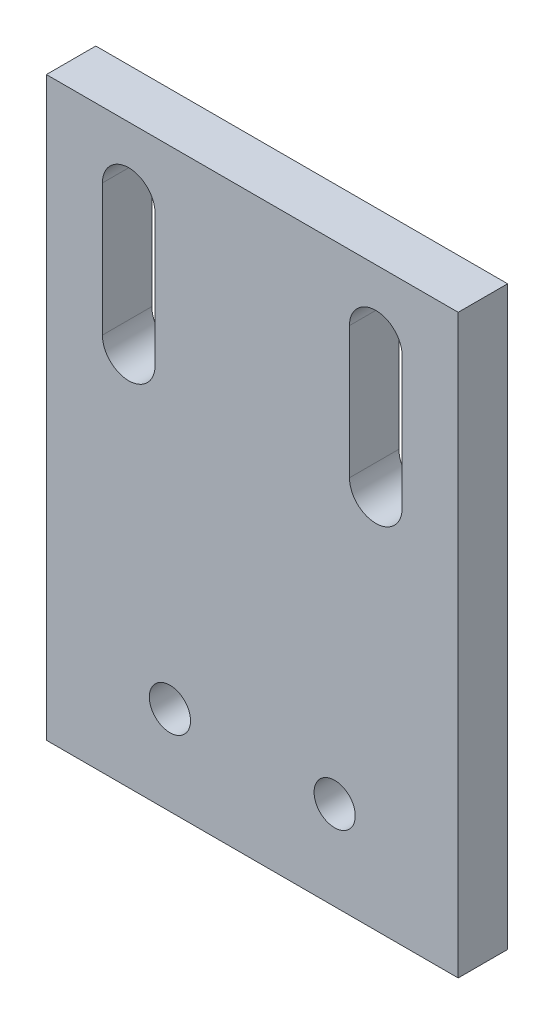
ISO-10303-21;
HEADER;
FILE_DESCRIPTION(('STEP AP214'),'2;1');
FILE_NAME('part.step','',(''),(''),'','','');
FILE_SCHEMA(('AUTOMOTIVE_DESIGN { 1 0 10303 214 1 1 1 1 }'));
ENDSEC;
DATA;
#1=APPLICATION_CONTEXT('core data for automotive mechanical design processes');
#2=APPLICATION_PROTOCOL_DEFINITION('international standard','automotive_design',2000,#1);
#3=PRODUCT_CONTEXT('',#1,'mechanical');
#4=PRODUCT('Part','Part','',(#3));
#5=PRODUCT_RELATED_PRODUCT_CATEGORY('part','',(#4));
#6=PRODUCT_DEFINITION_FORMATION('','',#4);
#7=PRODUCT_DEFINITION_CONTEXT('part definition',#1,'design');
#8=PRODUCT_DEFINITION('design','',#6,#7);
#9=PRODUCT_DEFINITION_SHAPE('','',#8);
#10=(LENGTH_UNIT() NAMED_UNIT(*) SI_UNIT(.MILLI.,.METRE.));
#11=(NAMED_UNIT(*) PLANE_ANGLE_UNIT() SI_UNIT($,.RADIAN.));
#12=(NAMED_UNIT(*) SI_UNIT($,.STERADIAN.) SOLID_ANGLE_UNIT());
#13=UNCERTAINTY_MEASURE_WITH_UNIT(LENGTH_MEASURE(1.E-05),#10,'distance_accuracy_value','');
#14=(GEOMETRIC_REPRESENTATION_CONTEXT(3) GLOBAL_UNCERTAINTY_ASSIGNED_CONTEXT((#13)) GLOBAL_UNIT_ASSIGNED_CONTEXT((#10,
#11,#12)) REPRESENTATION_CONTEXT('',''));
#15=CARTESIAN_POINT('',(0.,0.,0.));
#16=DIRECTION('',(0.,0.,1.));
#17=DIRECTION('',(1.,0.,0.));
#18=AXIS2_PLACEMENT_3D('',#15,#16,#17);
#19=CARTESIAN_POINT('',(110.031636064282,-1.89706178448641,3.));
#20=DIRECTION('',(1.,0.,0.));
#21=DIRECTION('',(0.,0.,-1.));
#22=AXIS2_PLACEMENT_3D('',#19,#20,#21);
#23=PLANE('',#22);
#24=DIRECTION('',(0.,-1.,0.));
#25=VECTOR('',#24,1.);
#26=CARTESIAN_POINT('',(110.031636064282,-1.89706178448641,0.));
#27=LINE('',#26,#25);
#28=CARTESIAN_POINT('',(110.031636064282,33.1029382155136,0.));
#29=VERTEX_POINT('',#28);
#30=CARTESIAN_POINT('',(110.031636064282,-1.89706178448641,0.));
#31=VERTEX_POINT('',#30);
#32=EDGE_CURVE('E202',#29,#31,#27,.T.);
#33=ORIENTED_EDGE('',*,*,#32,.T.);
#34=DIRECTION('',(0.,0.,-1.));
#35=VECTOR('',#34,1.);
#36=CARTESIAN_POINT('',(110.031636064282,-1.89706178448641,3.));
#37=LINE('',#36,#35);
#38=CARTESIAN_POINT('',(110.031636064282,-1.89706178448641,3.));
#39=VERTEX_POINT('',#38);
#40=EDGE_CURVE('E11',#39,#31,#37,.T.);
#41=ORIENTED_EDGE('',*,*,#40,.F.);
#42=DIRECTION('',(0.,-1.,0.));
#43=VECTOR('',#42,1.);
#44=CARTESIAN_POINT('',(110.031636064282,-1.89706178448641,3.));
#45=LINE('',#44,#43);
#46=CARTESIAN_POINT('',(110.031636064282,33.1029382155136,3.));
#47=VERTEX_POINT('',#46);
#48=EDGE_CURVE('E203',#47,#39,#45,.T.);
#49=ORIENTED_EDGE('',*,*,#48,.F.);
#50=DIRECTION('',(0.,0.,-1.));
#51=VECTOR('',#50,1.);
#52=CARTESIAN_POINT('',(110.031636064282,33.1029382155136,3.));
#53=LINE('',#52,#51);
#54=EDGE_CURVE('E213',#47,#29,#53,.T.);
#55=ORIENTED_EDGE('',*,*,#54,.T.);
#56=EDGE_LOOP('',(#33,#41,#49,#55));
#57=FACE_BOUND('',#56,.T.);
#58=ADVANCED_FACE('F34',(#57),#23,.F.);
#59=CARTESIAN_POINT('',(110.031636064282,-1.89706178448641,3.));
#60=DIRECTION('',(0.,1.,0.));
#61=DIRECTION('',(0.,0.,1.));
#62=AXIS2_PLACEMENT_3D('',#59,#60,#61);
#63=PLANE('',#62);
#64=DIRECTION('',(1.,0.,0.));
#65=VECTOR('',#64,1.);
#66=CARTESIAN_POINT('',(110.031636064282,-1.89706178448641,0.));
#67=LINE('',#66,#65);
#68=CARTESIAN_POINT('',(135.031636064282,-1.89706178448641,0.));
#69=VERTEX_POINT('',#68);
#70=EDGE_CURVE('E216',#31,#69,#67,.T.);
#71=ORIENTED_EDGE('',*,*,#70,.T.);
#72=DIRECTION('',(0.,0.,-1.));
#73=VECTOR('',#72,1.);
#74=CARTESIAN_POINT('',(135.031636064282,-1.89706178448641,3.));
#75=LINE('',#74,#73);
#76=CARTESIAN_POINT('',(135.031636064282,-1.89706178448641,3.));
#77=VERTEX_POINT('',#76);
#78=EDGE_CURVE('E41',#77,#69,#75,.T.);
#79=ORIENTED_EDGE('',*,*,#78,.F.);
#80=DIRECTION('',(1.,0.,0.));
#81=VECTOR('',#80,1.);
#82=CARTESIAN_POINT('',(110.031636064282,-1.89706178448641,3.));
#83=LINE('',#82,#81);
#84=EDGE_CURVE('E206',#39,#77,#83,.T.);
#85=ORIENTED_EDGE('',*,*,#84,.F.);
#86=ORIENTED_EDGE('',*,*,#40,.T.);
#87=EDGE_LOOP('',(#71,#79,#85,#86));
#88=FACE_BOUND('',#87,.T.);
#89=ADVANCED_FACE('F245',(#88),#63,.F.);
#90=CARTESIAN_POINT('',(135.031636064282,-1.89706178448641,3.));
#91=DIRECTION('',(-1.,0.,0.));
#92=DIRECTION('',(0.,0.,1.));
#93=AXIS2_PLACEMENT_3D('',#90,#91,#92);
#94=PLANE('',#93);
#95=DIRECTION('',(0.,1.,0.));
#96=VECTOR('',#95,1.);
#97=CARTESIAN_POINT('',(135.031636064282,-1.89706178448641,0.));
#98=LINE('',#97,#96);
#99=CARTESIAN_POINT('',(135.031636064282,33.1029382155136,0.));
#100=VERTEX_POINT('',#99);
#101=EDGE_CURVE('E218',#69,#100,#98,.T.);
#102=ORIENTED_EDGE('',*,*,#101,.T.);
#103=DIRECTION('',(0.,0.,-1.));
#104=VECTOR('',#103,1.);
#105=CARTESIAN_POINT('',(135.031636064282,33.1029382155136,3.));
#106=LINE('',#105,#104);
#107=CARTESIAN_POINT('',(135.031636064282,33.1029382155136,3.));
#108=VERTEX_POINT('',#107);
#109=EDGE_CURVE('E223',#108,#100,#106,.T.);
#110=ORIENTED_EDGE('',*,*,#109,.F.);
#111=DIRECTION('',(0.,1.,0.));
#112=VECTOR('',#111,1.);
#113=CARTESIAN_POINT('',(135.031636064282,-1.89706178448641,3.));
#114=LINE('',#113,#112);
#115=EDGE_CURVE('E209',#77,#108,#114,.T.);
#116=ORIENTED_EDGE('',*,*,#115,.F.);
#117=ORIENTED_EDGE('',*,*,#78,.T.);
#118=EDGE_LOOP('',(#102,#110,#116,#117));
#119=FACE_BOUND('',#118,.T.);
#120=ADVANCED_FACE('F230',(#119),#94,.F.);
#121=CARTESIAN_POINT('',(110.031636064282,33.1029382155136,3.));
#122=DIRECTION('',(0.,-1.,0.));
#123=DIRECTION('',(0.,0.,-1.));
#124=AXIS2_PLACEMENT_3D('',#121,#122,#123);
#125=PLANE('',#124);
#126=DIRECTION('',(-1.,0.,0.));
#127=VECTOR('',#126,1.);
#128=CARTESIAN_POINT('',(110.031636064282,33.1029382155136,0.));
#129=LINE('',#128,#127);
#130=EDGE_CURVE('E207',#100,#29,#129,.T.);
#131=ORIENTED_EDGE('',*,*,#130,.T.);
#132=ORIENTED_EDGE('',*,*,#54,.F.);
#133=DIRECTION('',(-1.,0.,0.));
#134=VECTOR('',#133,1.);
#135=CARTESIAN_POINT('',(110.031636064282,33.1029382155136,3.));
#136=LINE('',#135,#134);
#137=EDGE_CURVE('E211',#108,#47,#136,.T.);
#138=ORIENTED_EDGE('',*,*,#137,.F.);
#139=ORIENTED_EDGE('',*,*,#109,.T.);
#140=EDGE_LOOP('',(#131,#132,#138,#139));
#141=FACE_BOUND('',#140,.T.);
#142=ADVANCED_FACE('F238',(#141),#125,.F.);
#143=CARTESIAN_POINT('',(0.,0.,3.));
#144=DIRECTION('',(0.,0.,-1.));
#145=DIRECTION('',(-1.,0.,0.));
#146=AXIS2_PLACEMENT_3D('',#143,#144,#145);
#147=PLANE('',#146);
#148=DIRECTION('',(0.,-1.,0.));
#149=VECTOR('',#148,1.);
#150=CARTESIAN_POINT('',(128.431636064282,29.1029382155136,3.));
#151=LINE('',#150,#149);
#152=CARTESIAN_POINT('',(128.431636064282,29.1029382155136,3.));
#153=VERTEX_POINT('',#152);
#154=CARTESIAN_POINT('',(128.431636064282,21.1029382155136,3.));
#155=VERTEX_POINT('',#154);
#156=EDGE_CURVE('E149',#153,#155,#151,.T.);
#157=ORIENTED_EDGE('',*,*,#156,.F.);
#158=CARTESIAN_POINT('',(130.031636064282,29.1029382155136,3.));
#159=DIRECTION('',(0.,0.,1.));
#160=DIRECTION('',(1.,0.,0.));
#161=AXIS2_PLACEMENT_3D('',#158,#159,#160);
#162=CIRCLE('',#161,1.59999999999999);
#163=CARTESIAN_POINT('',(131.631636064282,29.1029382155136,3.));
#164=VERTEX_POINT('',#163);
#165=EDGE_CURVE('E48',#164,#153,#162,.T.);
#166=ORIENTED_EDGE('',*,*,#165,.F.);
#167=DIRECTION('',(0.,1.,0.));
#168=VECTOR('',#167,1.);
#169=CARTESIAN_POINT('',(131.631636064282,29.1029382155136,3.));
#170=LINE('',#169,#168);
#171=CARTESIAN_POINT('',(131.631636064282,21.1029382155136,3.));
#172=VERTEX_POINT('',#171);
#173=EDGE_CURVE('E140',#172,#164,#170,.T.);
#174=ORIENTED_EDGE('',*,*,#173,.F.);
#175=CARTESIAN_POINT('',(130.031636064282,21.1029382155136,3.));
#176=DIRECTION('',(0.,0.,1.));
#177=DIRECTION('',(1.,0.,0.));
#178=AXIS2_PLACEMENT_3D('',#175,#176,#177);
#179=CIRCLE('',#178,1.59999999999999);
#180=EDGE_CURVE('E143',#155,#172,#179,.T.);
#181=ORIENTED_EDGE('',*,*,#180,.F.);
#182=EDGE_LOOP('',(#157,#166,#174,#181));
#183=FACE_BOUND('',#182,.T.);
#184=DIRECTION('',(0.,-1.,0.));
#185=VECTOR('',#184,1.);
#186=CARTESIAN_POINT('',(113.431636064282,29.1029382155136,3.));
#187=LINE('',#186,#185);
#188=CARTESIAN_POINT('',(113.431636064282,29.1029382155136,3.));
#189=VERTEX_POINT('',#188);
#190=CARTESIAN_POINT('',(113.431636064282,21.1029382155136,3.));
#191=VERTEX_POINT('',#190);
#192=EDGE_CURVE('E174',#189,#191,#187,.T.);
#193=ORIENTED_EDGE('',*,*,#192,.F.);
#194=CARTESIAN_POINT('',(115.031636064282,29.1029382155136,3.));
#195=DIRECTION('',(0.,0.,1.));
#196=DIRECTION('',(1.,0.,0.));
#197=AXIS2_PLACEMENT_3D('',#194,#195,#196);
#198=CIRCLE('',#197,1.60000000000002);
#199=CARTESIAN_POINT('',(116.631636064282,29.1029382155136,3.));
#200=VERTEX_POINT('',#199);
#201=EDGE_CURVE('E155',#200,#189,#198,.T.);
#202=ORIENTED_EDGE('',*,*,#201,.F.);
#203=DIRECTION('',(0.,1.,0.));
#204=VECTOR('',#203,1.);
#205=CARTESIAN_POINT('',(116.631636064282,29.1029382155136,3.));
#206=LINE('',#205,#204);
#207=CARTESIAN_POINT('',(116.631636064282,21.1029382155136,3.));
#208=VERTEX_POINT('',#207);
#209=EDGE_CURVE('E163',#208,#200,#206,.T.);
#210=ORIENTED_EDGE('',*,*,#209,.F.);
#211=CARTESIAN_POINT('',(115.031636064282,21.1029382155136,3.));
#212=DIRECTION('',(0.,0.,1.));
#213=DIRECTION('',(1.,0.,0.));
#214=AXIS2_PLACEMENT_3D('',#211,#212,#213);
#215=CIRCLE('',#214,1.6);
#216=EDGE_CURVE('E177',#191,#208,#215,.T.);
#217=ORIENTED_EDGE('',*,*,#216,.F.);
#218=EDGE_LOOP('',(#193,#202,#210,#217));
#219=FACE_BOUND('',#218,.T.);
#220=CARTESIAN_POINT('',(117.531636064282,3.50000000000017,3.));
#221=DIRECTION('',(0.,0.,1.));
#222=DIRECTION('',(1.,0.,0.));
#223=AXIS2_PLACEMENT_3D('',#220,#221,#222);
#224=CIRCLE('',#223,1.24999999999999);
#225=CARTESIAN_POINT('',(118.781636064282,3.50000000000017,3.));
#226=VERTEX_POINT('',#225);
#227=EDGE_CURVE('E184',#226,#226,#224,.T.);
#228=ORIENTED_EDGE('',*,*,#227,.F.);
#229=EDGE_LOOP('',(#228));
#230=FACE_BOUND('',#229,.T.);
#231=CARTESIAN_POINT('',(127.531636064282,3.50000000000017,3.));
#232=DIRECTION('',(0.,0.,1.));
#233=DIRECTION('',(1.,0.,0.));
#234=AXIS2_PLACEMENT_3D('',#231,#232,#233);
#235=CIRCLE('',#234,1.25);
#236=CARTESIAN_POINT('',(128.781636064282,3.50000000000017,3.));
#237=VERTEX_POINT('',#236);
#238=EDGE_CURVE('E196',#237,#237,#235,.T.);
#239=ORIENTED_EDGE('',*,*,#238,.F.);
#240=EDGE_LOOP('',(#239));
#241=FACE_BOUND('',#240,.T.);
#242=ORIENTED_EDGE('',*,*,#48,.T.);
#243=ORIENTED_EDGE('',*,*,#84,.T.);
#244=ORIENTED_EDGE('',*,*,#115,.T.);
#245=ORIENTED_EDGE('',*,*,#137,.T.);
#246=EDGE_LOOP('',(#242,#243,#244,#245));
#247=FACE_BOUND('',#246,.T.);
#248=ADVANCED_FACE('F244',(#183,#219,#230,#241,#247),#147,.F.);
#249=CARTESIAN_POINT('',(0.,0.,0.));
#250=DIRECTION('',(0.,0.,-1.));
#251=DIRECTION('',(-1.,0.,0.));
#252=AXIS2_PLACEMENT_3D('',#249,#250,#251);
#253=PLANE('',#252);
#254=CARTESIAN_POINT('',(130.031636064282,29.1029382155136,0.));
#255=DIRECTION('',(0.,0.,1.));
#256=DIRECTION('',(1.,0.,0.));
#257=AXIS2_PLACEMENT_3D('',#254,#255,#256);
#258=CIRCLE('',#257,1.59999999999999);
#259=CARTESIAN_POINT('',(131.631636064282,29.1029382155136,0.));
#260=VERTEX_POINT('',#259);
#261=CARTESIAN_POINT('',(128.431636064282,29.1029382155136,0.));
#262=VERTEX_POINT('',#261);
#263=EDGE_CURVE('E124',#260,#262,#258,.T.);
#264=ORIENTED_EDGE('',*,*,#263,.T.);
#265=DIRECTION('',(0.,-1.,0.));
#266=VECTOR('',#265,1.);
#267=CARTESIAN_POINT('',(128.431636064282,29.1029382155136,0.));
#268=LINE('',#267,#266);
#269=CARTESIAN_POINT('',(128.431636064282,21.1029382155136,0.));
#270=VERTEX_POINT('',#269);
#271=EDGE_CURVE('E133',#262,#270,#268,.T.);
#272=ORIENTED_EDGE('',*,*,#271,.T.);
#273=CARTESIAN_POINT('',(130.031636064282,21.1029382155136,0.));
#274=DIRECTION('',(0.,0.,1.));
#275=DIRECTION('',(1.,0.,0.));
#276=AXIS2_PLACEMENT_3D('',#273,#274,#275);
#277=CIRCLE('',#276,1.59999999999999);
#278=CARTESIAN_POINT('',(131.631636064282,21.1029382155136,0.));
#279=VERTEX_POINT('',#278);
#280=EDGE_CURVE('E56',#270,#279,#277,.T.);
#281=ORIENTED_EDGE('',*,*,#280,.T.);
#282=DIRECTION('',(0.,1.,0.));
#283=VECTOR('',#282,1.);
#284=CARTESIAN_POINT('',(131.631636064282,29.1029382155136,0.));
#285=LINE('',#284,#283);
#286=EDGE_CURVE('E130',#279,#260,#285,.T.);
#287=ORIENTED_EDGE('',*,*,#286,.T.);
#288=EDGE_LOOP('',(#264,#272,#281,#287));
#289=FACE_BOUND('',#288,.T.);
#290=CARTESIAN_POINT('',(115.031636064282,29.1029382155136,0.));
#291=DIRECTION('',(0.,0.,1.));
#292=DIRECTION('',(1.,0.,0.));
#293=AXIS2_PLACEMENT_3D('',#290,#291,#292);
#294=CIRCLE('',#293,1.60000000000002);
#295=CARTESIAN_POINT('',(116.631636064282,29.1029382155136,0.));
#296=VERTEX_POINT('',#295);
#297=CARTESIAN_POINT('',(113.431636064282,29.1029382155136,0.));
#298=VERTEX_POINT('',#297);
#299=EDGE_CURVE('E159',#296,#298,#294,.T.);
#300=ORIENTED_EDGE('',*,*,#299,.T.);
#301=DIRECTION('',(0.,-1.,0.));
#302=VECTOR('',#301,1.);
#303=CARTESIAN_POINT('',(113.431636064282,29.1029382155136,0.));
#304=LINE('',#303,#302);
#305=CARTESIAN_POINT('',(113.431636064282,21.1029382155136,0.));
#306=VERTEX_POINT('',#305);
#307=EDGE_CURVE('E162',#298,#306,#304,.T.);
#308=ORIENTED_EDGE('',*,*,#307,.T.);
#309=CARTESIAN_POINT('',(115.031636064282,21.1029382155136,0.));
#310=DIRECTION('',(0.,0.,1.));
#311=DIRECTION('',(1.,0.,0.));
#312=AXIS2_PLACEMENT_3D('',#309,#310,#311);
#313=CIRCLE('',#312,1.6);
#314=CARTESIAN_POINT('',(116.631636064282,21.1029382155136,0.));
#315=VERTEX_POINT('',#314);
#316=EDGE_CURVE('E166',#306,#315,#313,.T.);
#317=ORIENTED_EDGE('',*,*,#316,.T.);
#318=DIRECTION('',(0.,1.,0.));
#319=VECTOR('',#318,1.);
#320=CARTESIAN_POINT('',(116.631636064282,29.1029382155136,0.));
#321=LINE('',#320,#319);
#322=EDGE_CURVE('E169',#315,#296,#321,.T.);
#323=ORIENTED_EDGE('',*,*,#322,.T.);
#324=EDGE_LOOP('',(#300,#308,#317,#323));
#325=FACE_BOUND('',#324,.T.);
#326=CARTESIAN_POINT('',(117.531636064282,3.50000000000017,0.));
#327=DIRECTION('',(0.,0.,1.));
#328=DIRECTION('',(1.,0.,0.));
#329=AXIS2_PLACEMENT_3D('',#326,#327,#328);
#330=CIRCLE('',#329,1.25);
#331=CARTESIAN_POINT('',(118.781636064282,3.50000000000017,0.));
#332=VERTEX_POINT('',#331);
#333=EDGE_CURVE('E193',#332,#332,#330,.T.);
#334=ORIENTED_EDGE('',*,*,#333,.T.);
#335=EDGE_LOOP('',(#334));
#336=FACE_BOUND('',#335,.T.);
#337=CARTESIAN_POINT('',(127.531636064282,3.50000000000017,0.));
#338=DIRECTION('',(0.,0.,1.));
#339=DIRECTION('',(1.,0.,0.));
#340=AXIS2_PLACEMENT_3D('',#337,#338,#339);
#341=CIRCLE('',#340,1.25);
#342=CARTESIAN_POINT('',(128.781636064282,3.50000000000017,0.));
#343=VERTEX_POINT('',#342);
#344=EDGE_CURVE('E199',#343,#343,#341,.T.);
#345=ORIENTED_EDGE('',*,*,#344,.T.);
#346=EDGE_LOOP('',(#345));
#347=FACE_BOUND('',#346,.T.);
#348=ORIENTED_EDGE('',*,*,#32,.F.);
#349=ORIENTED_EDGE('',*,*,#130,.F.);
#350=ORIENTED_EDGE('',*,*,#101,.F.);
#351=ORIENTED_EDGE('',*,*,#70,.F.);
#352=EDGE_LOOP('',(#348,#349,#350,#351));
#353=FACE_BOUND('',#352,.T.);
#354=ADVANCED_FACE('F137',(#289,#325,#336,#347,#353),#253,.T.);
#355=CARTESIAN_POINT('',(127.531636064282,3.50000000000017,3.));
#356=DIRECTION('',(0.,0.,1.));
#357=DIRECTION('',(1.,0.,0.));
#358=AXIS2_PLACEMENT_3D('',#355,#356,#357);
#359=CYLINDRICAL_SURFACE('',#358,1.25);
#360=ORIENTED_EDGE('',*,*,#344,.F.);
#361=EDGE_LOOP('',(#360));
#362=FACE_BOUND('',#361,.T.);
#363=ORIENTED_EDGE('',*,*,#238,.T.);
#364=EDGE_LOOP('',(#363));
#365=FACE_BOUND('',#364,.T.);
#366=ADVANCED_FACE('F257',(#362,#365),#359,.F.);
#367=CARTESIAN_POINT('',(117.531636064282,3.50000000000017,3.));
#368=DIRECTION('',(0.,0.,1.));
#369=DIRECTION('',(1.,0.,0.));
#370=AXIS2_PLACEMENT_3D('',#367,#368,#369);
#371=CYLINDRICAL_SURFACE('',#370,1.24999999999999);
#372=ORIENTED_EDGE('',*,*,#333,.F.);
#373=EDGE_LOOP('',(#372));
#374=FACE_BOUND('',#373,.T.);
#375=ORIENTED_EDGE('',*,*,#227,.T.);
#376=EDGE_LOOP('',(#375));
#377=FACE_BOUND('',#376,.T.);
#378=ADVANCED_FACE('F263',(#374,#377),#371,.F.);
#379=CARTESIAN_POINT('',(115.031636064282,29.1029382155136,0.));
#380=DIRECTION('',(0.,0.,1.));
#381=DIRECTION('',(1.,0.,0.));
#382=AXIS2_PLACEMENT_3D('',#379,#380,#381);
#383=CYLINDRICAL_SURFACE('',#382,1.60000000000002);
#384=ORIENTED_EDGE('',*,*,#201,.T.);
#385=DIRECTION('',(0.,0.,1.));
#386=VECTOR('',#385,1.);
#387=CARTESIAN_POINT('',(113.431636064282,29.1029382155136,0.));
#388=LINE('',#387,#386);
#389=EDGE_CURVE('E172',#298,#189,#388,.T.);
#390=ORIENTED_EDGE('',*,*,#389,.F.);
#391=ORIENTED_EDGE('',*,*,#299,.F.);
#392=DIRECTION('',(0.,0.,1.));
#393=VECTOR('',#392,1.);
#394=CARTESIAN_POINT('',(116.631636064282,29.1029382155136,0.));
#395=LINE('',#394,#393);
#396=EDGE_CURVE('E182',#296,#200,#395,.T.);
#397=ORIENTED_EDGE('',*,*,#396,.T.);
#398=EDGE_LOOP('',(#384,#390,#391,#397));
#399=FACE_BOUND('',#398,.T.);
#400=ADVANCED_FACE('F267',(#399),#383,.F.);
#401=CARTESIAN_POINT('',(116.631636064282,29.1029382155136,0.));
#402=DIRECTION('',(1.,0.,0.));
#403=DIRECTION('',(0.,1.,0.));
#404=AXIS2_PLACEMENT_3D('',#401,#402,#403);
#405=PLANE('',#404);
#406=ORIENTED_EDGE('',*,*,#209,.T.);
#407=ORIENTED_EDGE('',*,*,#396,.F.);
#408=ORIENTED_EDGE('',*,*,#322,.F.);
#409=DIRECTION('',(0.,0.,1.));
#410=VECTOR('',#409,1.);
#411=CARTESIAN_POINT('',(116.631636064282,21.1029382155136,0.));
#412=LINE('',#411,#410);
#413=EDGE_CURVE('E185',#315,#208,#412,.T.);
#414=ORIENTED_EDGE('',*,*,#413,.T.);
#415=EDGE_LOOP('',(#406,#407,#408,#414));
#416=FACE_BOUND('',#415,.T.);
#417=ADVANCED_FACE('F271',(#416),#405,.F.);
#418=CARTESIAN_POINT('',(115.031636064282,21.1029382155136,0.));
#419=DIRECTION('',(0.,0.,1.));
#420=DIRECTION('',(1.,0.,0.));
#421=AXIS2_PLACEMENT_3D('',#418,#419,#420);
#422=CYLINDRICAL_SURFACE('',#421,1.6);
#423=ORIENTED_EDGE('',*,*,#216,.T.);
#424=ORIENTED_EDGE('',*,*,#413,.F.);
#425=ORIENTED_EDGE('',*,*,#316,.F.);
#426=DIRECTION('',(0.,0.,1.));
#427=VECTOR('',#426,1.);
#428=CARTESIAN_POINT('',(113.431636064282,21.1029382155136,0.));
#429=LINE('',#428,#427);
#430=EDGE_CURVE('E187',#306,#191,#429,.T.);
#431=ORIENTED_EDGE('',*,*,#430,.T.);
#432=EDGE_LOOP('',(#423,#424,#425,#431));
#433=FACE_BOUND('',#432,.T.);
#434=ADVANCED_FACE('F276',(#433),#422,.F.);
#435=CARTESIAN_POINT('',(113.431636064282,29.1029382155136,0.));
#436=DIRECTION('',(-1.,0.,0.));
#437=DIRECTION('',(0.,-1.,0.));
#438=AXIS2_PLACEMENT_3D('',#435,#436,#437);
#439=PLANE('',#438);
#440=ORIENTED_EDGE('',*,*,#192,.T.);
#441=ORIENTED_EDGE('',*,*,#430,.F.);
#442=ORIENTED_EDGE('',*,*,#307,.F.);
#443=ORIENTED_EDGE('',*,*,#389,.T.);
#444=EDGE_LOOP('',(#440,#441,#442,#443));
#445=FACE_BOUND('',#444,.T.);
#446=ADVANCED_FACE('F273',(#445),#439,.F.);
#447=CARTESIAN_POINT('',(130.031636064282,29.1029382155136,0.));
#448=DIRECTION('',(0.,0.,1.));
#449=DIRECTION('',(1.,0.,0.));
#450=AXIS2_PLACEMENT_3D('',#447,#448,#449);
#451=CYLINDRICAL_SURFACE('',#450,1.59999999999999);
#452=ORIENTED_EDGE('',*,*,#165,.T.);
#453=DIRECTION('',(0.,0.,1.));
#454=VECTOR('',#453,1.);
#455=CARTESIAN_POINT('',(128.431636064282,29.1029382155136,0.));
#456=LINE('',#455,#454);
#457=EDGE_CURVE('E120',#262,#153,#456,.T.);
#458=ORIENTED_EDGE('',*,*,#457,.F.);
#459=ORIENTED_EDGE('',*,*,#263,.F.);
#460=DIRECTION('',(0.,0.,1.));
#461=VECTOR('',#460,1.);
#462=CARTESIAN_POINT('',(131.631636064282,29.1029382155136,0.));
#463=LINE('',#462,#461);
#464=EDGE_CURVE('E153',#260,#164,#463,.T.);
#465=ORIENTED_EDGE('',*,*,#464,.T.);
#466=EDGE_LOOP('',(#452,#458,#459,#465));
#467=FACE_BOUND('',#466,.T.);
#468=ADVANCED_FACE('F122',(#467),#451,.F.);
#469=CARTESIAN_POINT('',(131.631636064282,29.1029382155136,0.));
#470=DIRECTION('',(1.,0.,0.));
#471=DIRECTION('',(0.,0.,-1.));
#472=AXIS2_PLACEMENT_3D('',#469,#470,#471);
#473=PLANE('',#472);
#474=ORIENTED_EDGE('',*,*,#173,.T.);
#475=ORIENTED_EDGE('',*,*,#464,.F.);
#476=ORIENTED_EDGE('',*,*,#286,.F.);
#477=DIRECTION('',(0.,0.,1.));
#478=VECTOR('',#477,1.);
#479=CARTESIAN_POINT('',(131.631636064282,21.1029382155136,0.));
#480=LINE('',#479,#478);
#481=EDGE_CURVE('E156',#279,#172,#480,.T.);
#482=ORIENTED_EDGE('',*,*,#481,.T.);
#483=EDGE_LOOP('',(#474,#475,#476,#482));
#484=FACE_BOUND('',#483,.T.);
#485=ADVANCED_FACE('F286',(#484),#473,.F.);
#486=CARTESIAN_POINT('',(130.031636064282,21.1029382155136,0.));
#487=DIRECTION('',(0.,0.,1.));
#488=DIRECTION('',(1.,0.,0.));
#489=AXIS2_PLACEMENT_3D('',#486,#487,#488);
#490=CYLINDRICAL_SURFACE('',#489,1.59999999999999);
#491=ORIENTED_EDGE('',*,*,#180,.T.);
#492=ORIENTED_EDGE('',*,*,#481,.F.);
#493=ORIENTED_EDGE('',*,*,#280,.F.);
#494=DIRECTION('',(0.,0.,1.));
#495=VECTOR('',#494,1.);
#496=CARTESIAN_POINT('',(128.431636064282,21.1029382155136,0.));
#497=LINE('',#496,#495);
#498=EDGE_CURVE('E129',#270,#155,#497,.T.);
#499=ORIENTED_EDGE('',*,*,#498,.T.);
#500=EDGE_LOOP('',(#491,#492,#493,#499));
#501=FACE_BOUND('',#500,.T.);
#502=ADVANCED_FACE('F289',(#501),#490,.F.);
#503=CARTESIAN_POINT('',(128.431636064282,29.1029382155136,0.));
#504=DIRECTION('',(-1.,0.,0.));
#505=DIRECTION('',(0.,0.,1.));
#506=AXIS2_PLACEMENT_3D('',#503,#504,#505);
#507=PLANE('',#506);
#508=ORIENTED_EDGE('',*,*,#156,.T.);
#509=ORIENTED_EDGE('',*,*,#498,.F.);
#510=ORIENTED_EDGE('',*,*,#271,.F.);
#511=ORIENTED_EDGE('',*,*,#457,.T.);
#512=EDGE_LOOP('',(#508,#509,#510,#511));
#513=FACE_BOUND('',#512,.T.);
#514=ADVANCED_FACE('F134',(#513),#507,.F.);
#515=CLOSED_SHELL('',(#58,#89,#120,#142,#248,#354,#366,#378,#400,#417,#434,#446,#468,#485,#502,#514));
#516=MANIFOLD_SOLID_BREP('B2',#515);
#517=ADVANCED_BREP_SHAPE_REPRESENTATION('',(#18,#516),#14);
#518=SHAPE_DEFINITION_REPRESENTATION(#9,#517);
ENDSEC;
END-ISO-10303-21;
